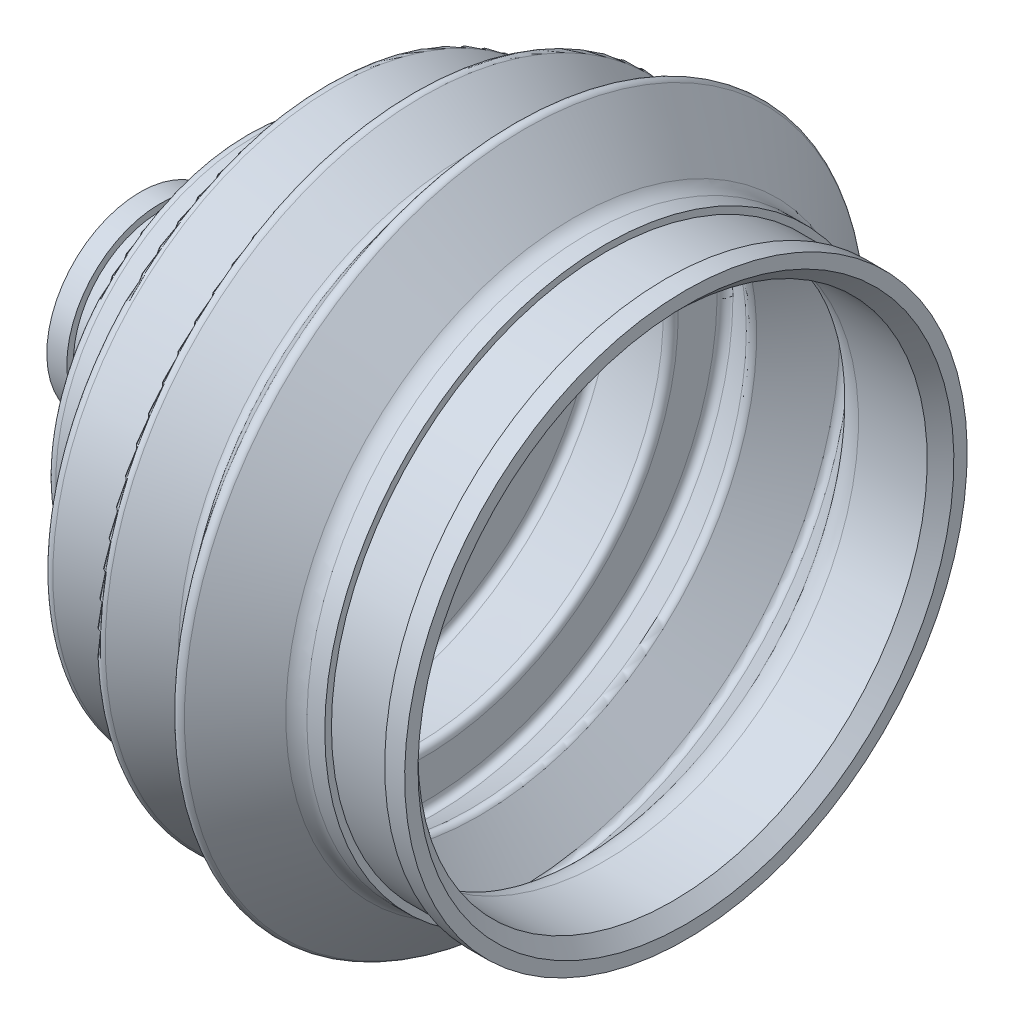
ISO-10303-21;
HEADER;
FILE_DESCRIPTION(('STEP AP214'),'2;1');
FILE_NAME('part.step','',(''),(''),'','','');
FILE_SCHEMA(('AUTOMOTIVE_DESIGN { 1 0 10303 214 1 1 1 1 }'));
ENDSEC;
DATA;
#1=APPLICATION_CONTEXT('core data for automotive mechanical design processes');
#2=APPLICATION_PROTOCOL_DEFINITION('international standard','automotive_design',2000,#1);
#3=PRODUCT_CONTEXT('',#1,'mechanical');
#4=PRODUCT('Part','Part','',(#3));
#5=PRODUCT_RELATED_PRODUCT_CATEGORY('part','',(#4));
#6=PRODUCT_DEFINITION_FORMATION('','',#4);
#7=PRODUCT_DEFINITION_CONTEXT('part definition',#1,'design');
#8=PRODUCT_DEFINITION('design','',#6,#7);
#9=PRODUCT_DEFINITION_SHAPE('','',#8);
#10=(LENGTH_UNIT() NAMED_UNIT(*) SI_UNIT(.MILLI.,.METRE.));
#11=(NAMED_UNIT(*) PLANE_ANGLE_UNIT() SI_UNIT($,.RADIAN.));
#12=(NAMED_UNIT(*) SI_UNIT($,.STERADIAN.) SOLID_ANGLE_UNIT());
#13=UNCERTAINTY_MEASURE_WITH_UNIT(LENGTH_MEASURE(1.E-05),#10,'distance_accuracy_value','');
#14=(GEOMETRIC_REPRESENTATION_CONTEXT(3) GLOBAL_UNCERTAINTY_ASSIGNED_CONTEXT((#13)) GLOBAL_UNIT_ASSIGNED_CONTEXT((#10,
#11,#12)) REPRESENTATION_CONTEXT('',''));
#15=CARTESIAN_POINT('',(0.,0.,0.));
#16=DIRECTION('',(0.,0.,1.));
#17=DIRECTION('',(1.,0.,0.));
#18=AXIS2_PLACEMENT_3D('',#15,#16,#17);
#19=CARTESIAN_POINT('',(0.,0.,0.));
#20=DIRECTION('',(1.,0.,0.));
#21=DIRECTION('',(0.,1.,0.));
#22=AXIS2_PLACEMENT_3D('',#19,#20,#21);
#23=CYLINDRICAL_SURFACE('',#22,42.25);
#24=CARTESIAN_POINT('',(-14.6865063047029,0.,0.));
#25=DIRECTION('',(1.,0.,0.));
#26=DIRECTION('',(0.,1.,0.));
#27=AXIS2_PLACEMENT_3D('',#24,#25,#26);
#28=CIRCLE('',#27,42.25);
#29=CARTESIAN_POINT('',(-14.6865063047029,42.25,0.));
#30=VERTEX_POINT('',#29);
#31=EDGE_CURVE('E73',#30,#30,#28,.T.);
#32=ORIENTED_EDGE('',*,*,#31,.T.);
#33=EDGE_LOOP('',(#32));
#34=FACE_BOUND('',#33,.T.);
#35=CARTESIAN_POINT('',(-12.,0.,0.));
#36=DIRECTION('',(-1.,0.,0.));
#37=DIRECTION('',(0.,0.,1.));
#38=AXIS2_PLACEMENT_3D('',#35,#36,#37);
#39=CIRCLE('',#38,42.25);
#40=CARTESIAN_POINT('',(-12.,0.,42.25));
#41=VERTEX_POINT('',#40);
#42=EDGE_CURVE('E190',#41,#41,#39,.T.);
#43=ORIENTED_EDGE('',*,*,#42,.T.);
#44=EDGE_LOOP('',(#43));
#45=FACE_BOUND('',#44,.T.);
#46=ADVANCED_FACE('F41',(#34,#45),#23,.T.);
#47=CARTESIAN_POINT('',(0.,0.,0.));
#48=DIRECTION('',(1.,0.,0.));
#49=DIRECTION('',(0.,1.,0.));
#50=AXIS2_PLACEMENT_3D('',#47,#48,#49);
#51=CYLINDRICAL_SURFACE('',#50,14.);
#52=CARTESIAN_POINT('',(-79.,0.,0.));
#53=DIRECTION('',(-1.,0.,0.));
#54=DIRECTION('',(0.,0.,1.));
#55=AXIS2_PLACEMENT_3D('',#52,#53,#54);
#56=CIRCLE('',#55,14.);
#57=CARTESIAN_POINT('',(-79.,0.,14.));
#58=VERTEX_POINT('',#57);
#59=EDGE_CURVE('E200',#58,#58,#56,.T.);
#60=ORIENTED_EDGE('',*,*,#59,.T.);
#61=EDGE_LOOP('',(#60));
#62=FACE_BOUND('',#61,.T.);
#63=CARTESIAN_POINT('',(-82.,0.,0.));
#64=DIRECTION('',(1.,0.,0.));
#65=DIRECTION('',(0.,1.,0.));
#66=AXIS2_PLACEMENT_3D('',#63,#64,#65);
#67=CIRCLE('',#66,14.);
#68=CARTESIAN_POINT('',(-82.,14.,0.));
#69=VERTEX_POINT('',#68);
#70=EDGE_CURVE('E217',#69,#69,#67,.T.);
#71=ORIENTED_EDGE('',*,*,#70,.T.);
#72=EDGE_LOOP('',(#71));
#73=FACE_BOUND('',#72,.T.);
#74=ADVANCED_FACE('F264',(#62,#73),#51,.T.);
#75=CARTESIAN_POINT('',(-24.9021727970763,0.,0.));
#76=DIRECTION('',(-1.,0.,0.));
#77=DIRECTION('',(0.,-1.,0.));
#78=AXIS2_PLACEMENT_3D('',#75,#76,#77);
#79=CONICAL_SURFACE('',#78,49.6825447785467,0.825376850520737);
#80=CARTESIAN_POINT('',(-24.1021512171663,0.,0.));
#81=DIRECTION('',(-1.,0.,0.));
#82=DIRECTION('',(0.,-1.,0.));
#83=AXIS2_PLACEMENT_3D('',#80,#81,#82);
#84=CIRCLE('',#83,48.8158547336442);
#85=CARTESIAN_POINT('',(-24.1021512171663,-48.8158547336442,0.));
#86=VERTEX_POINT('',#85);
#87=EDGE_CURVE('E133',#86,#86,#84,.T.);
#88=ORIENTED_EDGE('',*,*,#87,.T.);
#89=EDGE_LOOP('',(#88));
#90=FACE_BOUND('',#89,.T.);
#91=CARTESIAN_POINT('',(-16.6567468476485,0.,0.));
#92=DIRECTION('',(-1.,0.,0.));
#93=DIRECTION('',(0.,0.,1.));
#94=AXIS2_PLACEMENT_3D('',#91,#92,#93);
#95=CIRCLE('',#94,40.75);
#96=CARTESIAN_POINT('',(-16.6567468476485,0.,40.75));
#97=VERTEX_POINT('',#96);
#98=EDGE_CURVE('E204',#97,#97,#95,.T.);
#99=ORIENTED_EDGE('',*,*,#98,.F.);
#100=EDGE_LOOP('',(#99));
#101=FACE_BOUND('',#100,.T.);
#102=ADVANCED_FACE('F273',(#90,#101),#79,.F.);
#103=CARTESIAN_POINT('',(-31.6553927156199,0.,0.));
#104=DIRECTION('',(1.,0.,0.));
#105=DIRECTION('',(0.,1.,0.));
#106=AXIS2_PLACEMENT_3D('',#103,#104,#105);
#107=CONICAL_SURFACE('',#106,40.9998334547049,0.909753157944212);
#108=CARTESIAN_POINT('',(-31.0957786878303,0.,0.));
#109=DIRECTION('',(-1.,0.,0.));
#110=DIRECTION('',(0.,-1.,0.));
#111=AXIS2_PLACEMENT_3D('',#108,#109,#110);
#112=CIRCLE('',#111,41.71933720472);
#113=CARTESIAN_POINT('',(-31.0957786878303,-41.71933720472,0.));
#114=VERTEX_POINT('',#113);
#115=EDGE_CURVE('E137',#114,#114,#112,.T.);
#116=ORIENTED_EDGE('',*,*,#115,.T.);
#117=EDGE_LOOP('',(#116));
#118=FACE_BOUND('',#117,.T.);
#119=CARTESIAN_POINT('',(-25.6263068791701,0.,0.));
#120=DIRECTION('',(1.,0.,0.));
#121=DIRECTION('',(0.,1.,0.));
#122=AXIS2_PLACEMENT_3D('',#119,#120,#121);
#123=CIRCLE('',#122,48.751515244426);
#124=CARTESIAN_POINT('',(-25.6263068791701,48.751515244426,0.));
#125=VERTEX_POINT('',#124);
#126=EDGE_CURVE('E141',#125,#125,#123,.T.);
#127=ORIENTED_EDGE('',*,*,#126,.T.);
#128=EDGE_LOOP('',(#127));
#129=FACE_BOUND('',#128,.T.);
#130=ADVANCED_FACE('F355',(#118,#129),#107,.F.);
#131=CARTESIAN_POINT('',(-39.5,0.,0.));
#132=DIRECTION('',(-1.,0.,0.));
#133=DIRECTION('',(0.,-1.,0.));
#134=AXIS2_PLACEMENT_3D('',#131,#132,#133);
#135=CONICAL_SURFACE('',#134,46.0116658863922,0.568524547731038);
#136=CARTESIAN_POINT('',(-37.9616107228978,0.,0.));
#137=DIRECTION('',(-1.,0.,0.));
#138=DIRECTION('',(0.,-1.,0.));
#139=AXIS2_PLACEMENT_3D('',#136,#137,#138);
#140=CIRCLE('',#139,45.0288060704658);
#141=CARTESIAN_POINT('',(-37.9616107228978,-45.0288060704658,0.));
#142=VERTEX_POINT('',#141);
#143=EDGE_CURVE('E145',#142,#142,#140,.T.);
#144=ORIENTED_EDGE('',*,*,#143,.T.);
#145=EDGE_LOOP('',(#144));
#146=FACE_BOUND('',#145,.T.);
#147=CARTESIAN_POINT('',(-32.4235201823088,0.,0.));
#148=DIRECTION('',(1.,0.,0.));
#149=DIRECTION('',(0.,1.,0.));
#150=AXIS2_PLACEMENT_3D('',#147,#148,#149);
#151=CIRCLE('',#150,41.4905815584228);
#152=CARTESIAN_POINT('',(-32.4235201823088,41.4905815584228,0.));
#153=VERTEX_POINT('',#152);
#154=EDGE_CURVE('E149',#153,#153,#151,.T.);
#155=ORIENTED_EDGE('',*,*,#154,.T.);
#156=EDGE_LOOP('',(#155));
#157=FACE_BOUND('',#156,.T.);
#158=ADVANCED_FACE('F351',(#146,#157),#135,.F.);
#159=CARTESIAN_POINT('',(-39.5,39.,0.));
#160=DIRECTION('',(1.,0.,0.));
#161=DIRECTION('',(0.,1.,0.));
#162=AXIS2_PLACEMENT_3D('',#159,#160,#161);
#163=PLANE('',#162);
#164=CARTESIAN_POINT('',(-39.5,0.,0.));
#165=DIRECTION('',(1.,0.,0.));
#166=DIRECTION('',(0.,1.,0.));
#167=AXIS2_PLACEMENT_3D('',#164,#165,#166);
#168=CIRCLE('',#167,38.335382341241);
#169=CARTESIAN_POINT('',(-39.5,38.335382341241,0.));
#170=VERTEX_POINT('',#169);
#171=EDGE_CURVE('E153',#170,#170,#168,.F.);
#172=ORIENTED_EDGE('',*,*,#171,.T.);
#173=EDGE_LOOP('',(#172));
#174=FACE_BOUND('',#173,.T.);
#175=CARTESIAN_POINT('',(-39.5,0.,0.));
#176=DIRECTION('',(1.,0.,0.));
#177=DIRECTION('',(0.,1.,0.));
#178=AXIS2_PLACEMENT_3D('',#175,#176,#177);
#179=CIRCLE('',#178,44.1861098106536);
#180=CARTESIAN_POINT('',(-39.5,44.1861098106536,0.));
#181=VERTEX_POINT('',#180);
#182=EDGE_CURVE('E157',#181,#181,#179,.T.);
#183=ORIENTED_EDGE('',*,*,#182,.T.);
#184=EDGE_LOOP('',(#183));
#185=FACE_BOUND('',#184,.T.);
#186=ADVANCED_FACE('F347',(#174,#185),#163,.T.);
#187=CARTESIAN_POINT('',(-52.5,0.,0.));
#188=DIRECTION('',(-1.,0.,0.));
#189=DIRECTION('',(0.,-1.,0.));
#190=AXIS2_PLACEMENT_3D('',#187,#188,#189);
#191=CONICAL_SURFACE('',#190,40.7561470237229,0.280837724621203);
#192=CARTESIAN_POINT('',(-51.2228393486978,0.,0.));
#193=DIRECTION('',(-1.,0.,0.));
#194=DIRECTION('',(0.,-1.,0.));
#195=AXIS2_PLACEMENT_3D('',#192,#193,#194);
#196=CIRCLE('',#195,40.3877352973857);
#197=CARTESIAN_POINT('',(-51.2228393486978,-40.3877352973857,0.));
#198=VERTEX_POINT('',#197);
#199=EDGE_CURVE('E161',#198,#198,#196,.T.);
#200=ORIENTED_EDGE('',*,*,#199,.T.);
#201=EDGE_LOOP('',(#200));
#202=FACE_BOUND('',#201,.T.);
#203=CARTESIAN_POINT('',(-40.7771606513022,0.,0.));
#204=DIRECTION('',(1.,0.,0.));
#205=DIRECTION('',(0.,1.,0.));
#206=AXIS2_PLACEMENT_3D('',#203,#204,#205);
#207=CIRCLE('',#206,37.3745587500601);
#208=CARTESIAN_POINT('',(-40.7771606513022,37.3745587500601,0.));
#209=VERTEX_POINT('',#208);
#210=EDGE_CURVE('E165',#209,#209,#207,.T.);
#211=ORIENTED_EDGE('',*,*,#210,.T.);
#212=EDGE_LOOP('',(#211));
#213=FACE_BOUND('',#212,.T.);
#214=ADVANCED_FACE('F343',(#202,#213),#191,.F.);
#215=CARTESIAN_POINT('',(-52.5,27.,0.));
#216=DIRECTION('',(1.,0.,0.));
#217=DIRECTION('',(0.,1.,0.));
#218=AXIS2_PLACEMENT_3D('',#215,#216,#217);
#219=PLANE('',#218);
#220=CARTESIAN_POINT('',(-52.5,0.,0.));
#221=DIRECTION('',(1.,0.,0.));
#222=DIRECTION('',(0.,1.,0.));
#223=AXIS2_PLACEMENT_3D('',#220,#221,#222);
#224=CIRCLE('',#223,26.3465701350352);
#225=CARTESIAN_POINT('',(-52.5,26.3465701350351,0.));
#226=VERTEX_POINT('',#225);
#227=EDGE_CURVE('E169',#226,#226,#224,.F.);
#228=ORIENTED_EDGE('',*,*,#227,.T.);
#229=EDGE_LOOP('',(#228));
#230=FACE_BOUND('',#229,.T.);
#231=CARTESIAN_POINT('',(-52.5,0.,0.));
#232=DIRECTION('',(1.,0.,0.));
#233=DIRECTION('',(0.,1.,0.));
#234=AXIS2_PLACEMENT_3D('',#231,#232,#233);
#235=CIRCLE('',#234,39.4269117062048);
#236=CARTESIAN_POINT('',(-52.5,39.4269117062048,0.));
#237=VERTEX_POINT('',#236);
#238=EDGE_CURVE('E173',#237,#237,#235,.T.);
#239=ORIENTED_EDGE('',*,*,#238,.T.);
#240=EDGE_LOOP('',(#239));
#241=FACE_BOUND('',#240,.T.);
#242=ADVANCED_FACE('F339',(#230,#241),#219,.T.);
#243=CARTESIAN_POINT('',(-64.5,0.,0.));
#244=DIRECTION('',(-1.,0.,0.));
#245=DIRECTION('',(0.,-1.,0.));
#246=AXIS2_PLACEMENT_3D('',#243,#244,#245);
#247=CONICAL_SURFACE('',#246,28.2897104051055,0.264488382549233);
#248=CARTESIAN_POINT('',(-63.2385845242717,0.,0.));
#249=DIRECTION('',(-1.,0.,0.));
#250=DIRECTION('',(0.,-1.,0.));
#251=AXIS2_PLACEMENT_3D('',#248,#249,#250);
#252=CIRCLE('',#251,27.9480770470957);
#253=CARTESIAN_POINT('',(-63.2385845242717,-27.9480770470957,0.));
#254=VERTEX_POINT('',#253);
#255=EDGE_CURVE('E177',#254,#254,#252,.T.);
#256=ORIENTED_EDGE('',*,*,#255,.T.);
#257=EDGE_LOOP('',(#256));
#258=FACE_BOUND('',#257,.T.);
#259=CARTESIAN_POINT('',(-53.7614154757284,0.,0.));
#260=DIRECTION('',(1.,0.,0.));
#261=DIRECTION('',(0.,1.,0.));
#262=AXIS2_PLACEMENT_3D('',#259,#260,#261);
#263=CIRCLE('',#262,25.3813437631152);
#264=CARTESIAN_POINT('',(-53.7614154757284,25.3813437631152,0.));
#265=VERTEX_POINT('',#264);
#266=EDGE_CURVE('E181',#265,#265,#263,.T.);
#267=ORIENTED_EDGE('',*,*,#266,.T.);
#268=EDGE_LOOP('',(#267));
#269=FACE_BOUND('',#268,.T.);
#270=ADVANCED_FACE('F332',(#258,#269),#247,.F.);
#271=CARTESIAN_POINT('',(-64.5,14.,0.));
#272=DIRECTION('',(1.,0.,0.));
#273=DIRECTION('',(0.,1.,0.));
#274=AXIS2_PLACEMENT_3D('',#271,#272,#273);
#275=PLANE('',#274);
#276=CARTESIAN_POINT('',(-64.5,0.,0.));
#277=DIRECTION('',(1.,0.,0.));
#278=DIRECTION('',(0.,1.,0.));
#279=AXIS2_PLACEMENT_3D('',#276,#277,#278);
#280=CIRCLE('',#279,15.);
#281=CARTESIAN_POINT('',(-64.5,15.,0.));
#282=VERTEX_POINT('',#281);
#283=EDGE_CURVE('E10',#282,#282,#280,.F.);
#284=ORIENTED_EDGE('',*,*,#283,.T.);
#285=EDGE_LOOP('',(#284));
#286=FACE_BOUND('',#285,.T.);
#287=CARTESIAN_POINT('',(-64.5,0.,0.));
#288=DIRECTION('',(1.,0.,0.));
#289=DIRECTION('',(0.,1.,0.));
#290=AXIS2_PLACEMENT_3D('',#287,#288,#289);
#291=CIRCLE('',#290,26.9828506751758);
#292=CARTESIAN_POINT('',(-64.5,26.9828506751758,0.));
#293=VERTEX_POINT('',#292);
#294=EDGE_CURVE('E185',#293,#293,#291,.T.);
#295=ORIENTED_EDGE('',*,*,#294,.T.);
#296=EDGE_LOOP('',(#295));
#297=FACE_BOUND('',#296,.T.);
#298=ADVANCED_FACE('F325',(#286,#297),#275,.T.);
#299=CARTESIAN_POINT('',(-82.,12.5,0.));
#300=DIRECTION('',(1.,0.,0.));
#301=DIRECTION('',(0.,1.,0.));
#302=AXIS2_PLACEMENT_3D('',#299,#300,#301);
#303=PLANE('',#302);
#304=ORIENTED_EDGE('',*,*,#70,.F.);
#305=EDGE_LOOP('',(#304));
#306=FACE_BOUND('',#305,.T.);
#307=CARTESIAN_POINT('',(-82.,0.,0.));
#308=DIRECTION('',(1.,0.,0.));
#309=DIRECTION('',(0.,0.,-1.));
#310=AXIS2_PLACEMENT_3D('',#307,#308,#309);
#311=CIRCLE('',#310,9.99999999999999);
#312=CARTESIAN_POINT('',(-82.,0.,-9.99999999999999));
#313=VERTEX_POINT('',#312);
#314=EDGE_CURVE('E225',#313,#313,#311,.T.);
#315=ORIENTED_EDGE('',*,*,#314,.T.);
#316=EDGE_LOOP('',(#315));
#317=FACE_BOUND('',#316,.T.);
#318=ADVANCED_FACE('F323',(#306,#317),#303,.F.);
#319=CARTESIAN_POINT('',(-69.,0.,0.));
#320=DIRECTION('',(1.,0.,0.));
#321=DIRECTION('',(0.,1.,0.));
#322=AXIS2_PLACEMENT_3D('',#319,#320,#321);
#323=CIRCLE('',#322,14.);
#324=CARTESIAN_POINT('',(-69.,14.,0.));
#325=VERTEX_POINT('',#324);
#326=EDGE_CURVE('E59',#325,#325,#323,.F.);
#327=ORIENTED_EDGE('',*,*,#326,.T.);
#328=EDGE_LOOP('',(#327));
#329=FACE_BOUND('',#328,.T.);
#330=CARTESIAN_POINT('',(-70.,0.,0.));
#331=DIRECTION('',(1.,0.,0.));
#332=DIRECTION('',(0.,0.,-1.));
#333=AXIS2_PLACEMENT_3D('',#330,#331,#332);
#334=CIRCLE('',#333,14.);
#335=CARTESIAN_POINT('',(-70.,0.,-14.));
#336=VERTEX_POINT('',#335);
#337=EDGE_CURVE('E205',#336,#336,#334,.T.);
#338=ORIENTED_EDGE('',*,*,#337,.T.);
#339=EDGE_LOOP('',(#338));
#340=FACE_BOUND('',#339,.T.);
#341=ADVANCED_FACE('F276',(#329,#340),#51,.T.);
#342=CARTESIAN_POINT('',(-66.,14.,0.));
#343=DIRECTION('',(1.,0.,0.));
#344=DIRECTION('',(0.,1.,0.));
#345=AXIS2_PLACEMENT_3D('',#342,#343,#344);
#346=PLANE('',#345);
#347=CARTESIAN_POINT('',(-66.,0.,0.));
#348=DIRECTION('',(1.,0.,0.));
#349=DIRECTION('',(0.,1.,0.));
#350=AXIS2_PLACEMENT_3D('',#347,#348,#349);
#351=CIRCLE('',#350,17.);
#352=CARTESIAN_POINT('',(-66.,17.,0.));
#353=VERTEX_POINT('',#352);
#354=EDGE_CURVE('E65',#353,#353,#351,.T.);
#355=ORIENTED_EDGE('',*,*,#354,.T.);
#356=EDGE_LOOP('',(#355));
#357=FACE_BOUND('',#356,.T.);
#358=CARTESIAN_POINT('',(-66.,0.,0.));
#359=DIRECTION('',(1.,0.,0.));
#360=DIRECTION('',(0.,1.,0.));
#361=AXIS2_PLACEMENT_3D('',#358,#359,#360);
#362=CIRCLE('',#361,28.9431402700703);
#363=CARTESIAN_POINT('',(-66.,28.9431402700703,0.));
#364=VERTEX_POINT('',#363);
#365=EDGE_CURVE('E77',#364,#364,#362,.F.);
#366=ORIENTED_EDGE('',*,*,#365,.T.);
#367=EDGE_LOOP('',(#366));
#368=FACE_BOUND('',#367,.T.);
#369=ADVANCED_FACE('F330',(#357,#368),#346,.F.);
#370=CARTESIAN_POINT('',(-66.,0.,0.));
#371=DIRECTION('',(-1.,0.,0.));
#372=DIRECTION('',(0.,-1.,0.));
#373=AXIS2_PLACEMENT_3D('',#370,#371,#372);
#374=CONICAL_SURFACE('',#373,30.25,0.264488382549233);
#375=CARTESIAN_POINT('',(-55.2614154757284,0.,0.));
#376=DIRECTION('',(-1.,0.,0.));
#377=DIRECTION('',(0.,-1.,0.));
#378=AXIS2_PLACEMENT_3D('',#375,#376,#377);
#379=CIRCLE('',#378,27.3416333580097);
#380=CARTESIAN_POINT('',(-55.2614154757284,-27.3416333580098,0.));
#381=VERTEX_POINT('',#380);
#382=EDGE_CURVE('E85',#381,#381,#379,.T.);
#383=ORIENTED_EDGE('',*,*,#382,.T.);
#384=EDGE_LOOP('',(#383));
#385=FACE_BOUND('',#384,.T.);
#386=CARTESIAN_POINT('',(-64.7385845242717,0.,0.));
#387=DIRECTION('',(1.,0.,0.));
#388=DIRECTION('',(0.,1.,0.));
#389=AXIS2_PLACEMENT_3D('',#386,#387,#388);
#390=CIRCLE('',#389,29.9083666419902);
#391=CARTESIAN_POINT('',(-64.7385845242717,29.9083666419902,0.));
#392=VERTEX_POINT('',#391);
#393=EDGE_CURVE('E89',#392,#392,#390,.T.);
#394=ORIENTED_EDGE('',*,*,#393,.T.);
#395=EDGE_LOOP('',(#394));
#396=FACE_BOUND('',#395,.T.);
#397=ADVANCED_FACE('F600',(#385,#396),#374,.T.);
#398=CARTESIAN_POINT('',(-54.,27.,0.));
#399=DIRECTION('',(1.,0.,0.));
#400=DIRECTION('',(0.,1.,0.));
#401=AXIS2_PLACEMENT_3D('',#398,#399,#400);
#402=PLANE('',#401);
#403=CARTESIAN_POINT('',(-54.,0.,0.));
#404=DIRECTION('',(1.,0.,0.));
#405=DIRECTION('',(0.,1.,0.));
#406=AXIS2_PLACEMENT_3D('',#403,#404,#405);
#407=CIRCLE('',#406,28.3068597299297);
#408=CARTESIAN_POINT('',(-54.,28.3068597299297,0.));
#409=VERTEX_POINT('',#408);
#410=EDGE_CURVE('E93',#409,#409,#407,.T.);
#411=ORIENTED_EDGE('',*,*,#410,.T.);
#412=EDGE_LOOP('',(#411));
#413=FACE_BOUND('',#412,.T.);
#414=CARTESIAN_POINT('',(-54.,0.,0.));
#415=DIRECTION('',(1.,0.,0.));
#416=DIRECTION('',(0.,1.,0.));
#417=AXIS2_PLACEMENT_3D('',#414,#415,#416);
#418=CIRCLE('',#417,41.4207646824819);
#419=CARTESIAN_POINT('',(-54.,41.4207646824819,0.));
#420=VERTEX_POINT('',#419);
#421=EDGE_CURVE('E97',#420,#420,#418,.F.);
#422=ORIENTED_EDGE('',*,*,#421,.T.);
#423=EDGE_LOOP('',(#422));
#424=FACE_BOUND('',#423,.T.);
#425=ADVANCED_FACE('F604',(#413,#424),#402,.F.);
#426=CARTESIAN_POINT('',(-54.,0.,0.));
#427=DIRECTION('',(-1.,0.,0.));
#428=DIRECTION('',(0.,-1.,0.));
#429=AXIS2_PLACEMENT_3D('',#426,#427,#428);
#430=CONICAL_SURFACE('',#429,42.75,0.280837724621203);
#431=CARTESIAN_POINT('',(-42.2771606513022,0.,0.));
#432=DIRECTION('',(-1.,0.,0.));
#433=DIRECTION('',(0.,-1.,0.));
#434=AXIS2_PLACEMENT_3D('',#431,#432,#433);
#435=CIRCLE('',#434,39.3684117263372);
#436=CARTESIAN_POINT('',(-42.2771606513022,-39.3684117263372,0.));
#437=VERTEX_POINT('',#436);
#438=EDGE_CURVE('E101',#437,#437,#435,.T.);
#439=ORIENTED_EDGE('',*,*,#438,.T.);
#440=EDGE_LOOP('',(#439));
#441=FACE_BOUND('',#440,.T.);
#442=CARTESIAN_POINT('',(-52.7228393486978,0.,0.));
#443=DIRECTION('',(1.,0.,0.));
#444=DIRECTION('',(0.,1.,0.));
#445=AXIS2_PLACEMENT_3D('',#442,#443,#444);
#446=CIRCLE('',#445,42.3815882736628);
#447=CARTESIAN_POINT('',(-52.7228393486978,42.3815882736628,0.));
#448=VERTEX_POINT('',#447);
#449=EDGE_CURVE('E105',#448,#448,#446,.T.);
#450=ORIENTED_EDGE('',*,*,#449,.T.);
#451=EDGE_LOOP('',(#450));
#452=FACE_BOUND('',#451,.T.);
#453=ADVANCED_FACE('F613',(#441,#452),#430,.T.);
#454=CARTESIAN_POINT('',(-41.,39.,0.));
#455=DIRECTION('',(1.,0.,0.));
#456=DIRECTION('',(0.,1.,0.));
#457=AXIS2_PLACEMENT_3D('',#454,#455,#456);
#458=PLANE('',#457);
#459=CARTESIAN_POINT('',(-41.,0.,0.));
#460=DIRECTION('',(1.,0.,0.));
#461=DIRECTION('',(0.,1.,0.));
#462=AXIS2_PLACEMENT_3D('',#459,#460,#461);
#463=CIRCLE('',#462,40.3292353175181);
#464=CARTESIAN_POINT('',(-41.,40.3292353175181,0.));
#465=VERTEX_POINT('',#464);
#466=EDGE_CURVE('E109',#465,#465,#463,.T.);
#467=ORIENTED_EDGE('',*,*,#466,.T.);
#468=EDGE_LOOP('',(#467));
#469=FACE_BOUND('',#468,.T.);
#470=CARTESIAN_POINT('',(-41.,0.,0.));
#471=DIRECTION('',(1.,0.,0.));
#472=DIRECTION('',(0.,1.,0.));
#473=AXIS2_PLACEMENT_3D('',#470,#471,#472);
#474=CIRCLE('',#473,46.9244439242615);
#475=CARTESIAN_POINT('',(-41.,46.9244439242614,0.));
#476=VERTEX_POINT('',#475);
#477=EDGE_CURVE('E113',#476,#476,#474,.F.);
#478=ORIENTED_EDGE('',*,*,#477,.T.);
#479=EDGE_LOOP('',(#478));
#480=FACE_BOUND('',#479,.T.);
#481=ADVANCED_FACE('F621',(#469,#480),#458,.F.);
#482=CARTESIAN_POINT('',(-41.,0.,0.));
#483=DIRECTION('',(-1.,0.,0.));
#484=DIRECTION('',(0.,-1.,0.));
#485=AXIS2_PLACEMENT_3D('',#482,#483,#484);
#486=CONICAL_SURFACE('',#485,48.75,0.568524547731039);
#487=CARTESIAN_POINT('',(-32.768127466689,0.,0.));
#488=DIRECTION('',(-1.,0.,0.));
#489=DIRECTION('',(0.,-1.,0.));
#490=AXIS2_PLACEMENT_3D('',#487,#488,#489);
#491=CIRCLE('',#490,43.4907481037179);
#492=CARTESIAN_POINT('',(-32.768127466689,-43.4907481037179,0.));
#493=VERTEX_POINT('',#492);
#494=EDGE_CURVE('E117',#493,#493,#491,.T.);
#495=ORIENTED_EDGE('',*,*,#494,.T.);
#496=EDGE_LOOP('',(#495));
#497=FACE_BOUND('',#496,.T.);
#498=CARTESIAN_POINT('',(-39.4616107228978,0.,0.));
#499=DIRECTION('',(1.,0.,0.));
#500=DIRECTION('',(0.,1.,0.));
#501=AXIS2_PLACEMENT_3D('',#498,#499,#500);
#502=CIRCLE('',#501,47.7671401840736);
#503=CARTESIAN_POINT('',(-39.4616107228978,47.7671401840736,0.));
#504=VERTEX_POINT('',#503);
#505=EDGE_CURVE('E121',#504,#504,#502,.T.);
#506=ORIENTED_EDGE('',*,*,#505,.T.);
#507=EDGE_LOOP('',(#506));
#508=FACE_BOUND('',#507,.T.);
#509=ADVANCED_FACE('F629',(#497,#508),#486,.T.);
#510=CARTESIAN_POINT('',(-32.,0.,0.));
#511=DIRECTION('',(1.,0.,0.));
#512=DIRECTION('',(0.,1.,0.));
#513=AXIS2_PLACEMENT_3D('',#510,#511,#512);
#514=CONICAL_SURFACE('',#513,43.,0.909753157944212);
#515=CARTESIAN_POINT('',(-31.4403859722104,0.,0.));
#516=DIRECTION('',(1.,0.,0.));
#517=DIRECTION('',(0.,1.,0.));
#518=AXIS2_PLACEMENT_3D('',#515,#516,#517);
#519=CIRCLE('',#518,43.7195037500152);
#520=CARTESIAN_POINT('',(-31.4403859722104,43.7195037500152,0.));
#521=VERTEX_POINT('',#520);
#522=EDGE_CURVE('E125',#521,#521,#519,.T.);
#523=ORIENTED_EDGE('',*,*,#522,.T.);
#524=EDGE_LOOP('',(#523));
#525=FACE_BOUND('',#524,.T.);
#526=CARTESIAN_POINT('',(-25.7241340820939,0.,0.));
#527=DIRECTION('',(-1.,0.,0.));
#528=DIRECTION('',(0.,-1.,0.));
#529=AXIS2_PLACEMENT_3D('',#526,#527,#528);
#530=CIRCLE('',#529,51.0689704658793);
#531=CARTESIAN_POINT('',(-25.7241340820938,-51.0689704658793,0.));
#532=VERTEX_POINT('',#531);
#533=EDGE_CURVE('E129',#532,#532,#530,.T.);
#534=ORIENTED_EDGE('',*,*,#533,.T.);
#535=EDGE_LOOP('',(#534));
#536=FACE_BOUND('',#535,.T.);
#537=ADVANCED_FACE('F290',(#525,#536),#514,.T.);
#538=CARTESIAN_POINT('',(-25.,0.,0.));
#539=DIRECTION('',(-1.,0.,0.));
#540=DIRECTION('',(0.,-1.,0.));
#541=AXIS2_PLACEMENT_3D('',#538,#539,#540);
#542=CONICAL_SURFACE('',#541,52.,0.825376850520737);
#543=CARTESIAN_POINT('',(-16.8909166385854,0.,0.));
#544=DIRECTION('',(-1.,0.,0.));
#545=DIRECTION('',(0.,-1.,0.));
#546=AXIS2_PLACEMENT_3D('',#543,#544,#545);
#547=CIRCLE('',#546,43.2151596918008);
#548=CARTESIAN_POINT('',(-16.8909166385853,-43.2151596918008,0.));
#549=VERTEX_POINT('',#548);
#550=EDGE_CURVE('E69',#549,#549,#547,.T.);
#551=ORIENTED_EDGE('',*,*,#550,.T.);
#552=EDGE_LOOP('',(#551));
#553=FACE_BOUND('',#552,.T.);
#554=CARTESIAN_POINT('',(-24.19997842009,0.,0.));
#555=DIRECTION('',(1.,0.,0.));
#556=DIRECTION('',(0.,1.,0.));
#557=AXIS2_PLACEMENT_3D('',#554,#555,#556);
#558=CIRCLE('',#557,51.1333099550975);
#559=CARTESIAN_POINT('',(-24.19997842009,51.1333099550975,0.));
#560=VERTEX_POINT('',#559);
#561=EDGE_CURVE('E81',#560,#560,#558,.T.);
#562=ORIENTED_EDGE('',*,*,#561,.T.);
#563=EDGE_LOOP('',(#562));
#564=FACE_BOUND('',#563,.T.);
#565=ADVANCED_FACE('F281',(#553,#564),#542,.T.);
#566=CARTESIAN_POINT('',(-2.99999999999999,0.,0.));
#567=DIRECTION('',(1.,0.,0.));
#568=DIRECTION('',(0.,0.,-1.));
#569=AXIS2_PLACEMENT_3D('',#566,#567,#568);
#570=CIRCLE('',#569,42.25);
#571=CARTESIAN_POINT('',(-2.99999999999999,0.,-42.25));
#572=VERTEX_POINT('',#571);
#573=EDGE_CURVE('E195',#572,#572,#570,.T.);
#574=ORIENTED_EDGE('',*,*,#573,.T.);
#575=EDGE_LOOP('',(#574));
#576=FACE_BOUND('',#575,.T.);
#577=CARTESIAN_POINT('',(0.,0.,0.));
#578=DIRECTION('',(1.,0.,0.));
#579=DIRECTION('',(0.,1.,0.));
#580=AXIS2_PLACEMENT_3D('',#577,#578,#579);
#581=CIRCLE('',#580,42.25);
#582=CARTESIAN_POINT('',(0.,42.25,0.));
#583=VERTEX_POINT('',#582);
#584=EDGE_CURVE('E221',#583,#583,#581,.T.);
#585=ORIENTED_EDGE('',*,*,#584,.F.);
#586=EDGE_LOOP('',(#585));
#587=FACE_BOUND('',#586,.T.);
#588=ADVANCED_FACE('F267',(#576,#587),#23,.T.);
#589=CARTESIAN_POINT('',(0.,42.25,0.));
#590=DIRECTION('',(-1.,0.,0.));
#591=DIRECTION('',(0.,-1.,0.));
#592=AXIS2_PLACEMENT_3D('',#589,#590,#591);
#593=PLANE('',#592);
#594=CARTESIAN_POINT('',(0.,0.,0.));
#595=DIRECTION('',(-1.,0.,0.));
#596=DIRECTION('',(0.,-1.,0.));
#597=AXIS2_PLACEMENT_3D('',#594,#595,#596);
#598=CIRCLE('',#597,40.25);
#599=CARTESIAN_POINT('',(0.,-40.25,0.));
#600=VERTEX_POINT('',#599);
#601=EDGE_CURVE('E189',#600,#600,#598,.T.);
#602=ORIENTED_EDGE('',*,*,#601,.T.);
#603=EDGE_LOOP('',(#602));
#604=FACE_BOUND('',#603,.T.);
#605=ORIENTED_EDGE('',*,*,#584,.T.);
#606=EDGE_LOOP('',(#605));
#607=FACE_BOUND('',#606,.T.);
#608=ADVANCED_FACE('F280',(#604,#607),#593,.F.);
#609=CARTESIAN_POINT('',(0.,0.,0.));
#610=DIRECTION('',(1.,0.,0.));
#611=DIRECTION('',(0.,0.,-1.));
#612=AXIS2_PLACEMENT_3D('',#609,#610,#611);
#613=CYLINDRICAL_SURFACE('',#612,9.99999999999999);
#614=CARTESIAN_POINT('',(-69.5,0.,0.));
#615=DIRECTION('',(1.,0.,0.));
#616=DIRECTION('',(0.,1.,0.));
#617=AXIS2_PLACEMENT_3D('',#614,#615,#616);
#618=CIRCLE('',#617,9.99999999999999);
#619=CARTESIAN_POINT('',(-69.5,9.99999999999999,0.));
#620=VERTEX_POINT('',#619);
#621=EDGE_CURVE('E49',#620,#620,#618,.T.);
#622=ORIENTED_EDGE('',*,*,#621,.T.);
#623=EDGE_LOOP('',(#622));
#624=FACE_BOUND('',#623,.T.);
#625=ORIENTED_EDGE('',*,*,#314,.F.);
#626=EDGE_LOOP('',(#625));
#627=FACE_BOUND('',#626,.T.);
#628=ADVANCED_FACE('F287',(#624,#627),#613,.F.);
#629=CARTESIAN_POINT('',(0.,0.,0.));
#630=DIRECTION('',(1.,0.,0.));
#631=DIRECTION('',(0.,0.,-1.));
#632=AXIS2_PLACEMENT_3D('',#629,#630,#631);
#633=CYLINDRICAL_SURFACE('',#632,38.25);
#634=CARTESIAN_POINT('',(-12.3266198287264,0.,0.));
#635=DIRECTION('',(-1.,0.,0.));
#636=DIRECTION('',(0.,0.,1.));
#637=AXIS2_PLACEMENT_3D('',#634,#635,#636);
#638=CIRCLE('',#637,38.25);
#639=CARTESIAN_POINT('',(-12.3266198287264,0.,38.25));
#640=VERTEX_POINT('',#639);
#641=EDGE_CURVE('E54',#640,#640,#638,.T.);
#642=ORIENTED_EDGE('',*,*,#641,.T.);
#643=EDGE_LOOP('',(#642));
#644=FACE_BOUND('',#643,.T.);
#645=CARTESIAN_POINT('',(-1.99999999999998,0.,0.));
#646=DIRECTION('',(-1.,0.,0.));
#647=DIRECTION('',(0.,0.,1.));
#648=AXIS2_PLACEMENT_3D('',#645,#646,#647);
#649=CIRCLE('',#648,38.25);
#650=CARTESIAN_POINT('',(-1.99999999999998,0.,38.25));
#651=VERTEX_POINT('',#650);
#652=EDGE_CURVE('E213',#651,#651,#649,.F.);
#653=ORIENTED_EDGE('',*,*,#652,.T.);
#654=EDGE_LOOP('',(#653));
#655=FACE_BOUND('',#654,.T.);
#656=ADVANCED_FACE('F312',(#644,#655),#633,.F.);
#657=CARTESIAN_POINT('',(-1.99999999999998,0.,0.));
#658=DIRECTION('',(1.,0.,0.));
#659=DIRECTION('',(0.,0.,-1.));
#660=AXIS2_PLACEMENT_3D('',#657,#658,#659);
#661=CONICAL_SURFACE('',#660,38.25,0.785398163397447);
#662=ORIENTED_EDGE('',*,*,#601,.F.);
#663=EDGE_LOOP('',(#662));
#664=FACE_BOUND('',#663,.T.);
#665=ORIENTED_EDGE('',*,*,#652,.F.);
#666=EDGE_LOOP('',(#665));
#667=FACE_BOUND('',#666,.T.);
#668=ADVANCED_FACE('F310',(#664,#667),#661,.F.);
#669=CARTESIAN_POINT('',(-79.,18.,0.));
#670=DIRECTION('',(-1.,0.,0.));
#671=DIRECTION('',(0.,0.,1.));
#672=AXIS2_PLACEMENT_3D('',#669,#670,#671);
#673=PLANE('',#672);
#674=CARTESIAN_POINT('',(-79.,0.,0.));
#675=DIRECTION('',(1.,0.,0.));
#676=DIRECTION('',(0.,0.,-1.));
#677=AXIS2_PLACEMENT_3D('',#674,#675,#676);
#678=CIRCLE('',#677,13.);
#679=CARTESIAN_POINT('',(-79.,0.,-13.));
#680=VERTEX_POINT('',#679);
#681=EDGE_CURVE('E209',#680,#680,#678,.T.);
#682=ORIENTED_EDGE('',*,*,#681,.F.);
#683=EDGE_LOOP('',(#682));
#684=FACE_BOUND('',#683,.T.);
#685=ORIENTED_EDGE('',*,*,#59,.F.);
#686=EDGE_LOOP('',(#685));
#687=FACE_BOUND('',#686,.T.);
#688=ADVANCED_FACE('F304',(#684,#687),#673,.F.);
#689=CARTESIAN_POINT('',(-70.,18.,0.));
#690=DIRECTION('',(1.,0.,0.));
#691=DIRECTION('',(0.,0.,-1.));
#692=AXIS2_PLACEMENT_3D('',#689,#690,#691);
#693=PLANE('',#692);
#694=CARTESIAN_POINT('',(-70.,0.,0.));
#695=DIRECTION('',(1.,0.,0.));
#696=DIRECTION('',(0.,0.,-1.));
#697=AXIS2_PLACEMENT_3D('',#694,#695,#696);
#698=CIRCLE('',#697,13.);
#699=CARTESIAN_POINT('',(-70.,0.,-13.));
#700=VERTEX_POINT('',#699);
#701=EDGE_CURVE('E194',#700,#700,#698,.T.);
#702=ORIENTED_EDGE('',*,*,#701,.T.);
#703=EDGE_LOOP('',(#702));
#704=FACE_BOUND('',#703,.T.);
#705=ORIENTED_EDGE('',*,*,#337,.F.);
#706=EDGE_LOOP('',(#705));
#707=FACE_BOUND('',#706,.T.);
#708=ADVANCED_FACE('F301',(#704,#707),#693,.F.);
#709=CARTESIAN_POINT('',(0.,0.,0.));
#710=DIRECTION('',(1.,0.,0.));
#711=DIRECTION('',(0.,0.,-1.));
#712=AXIS2_PLACEMENT_3D('',#709,#710,#711);
#713=CYLINDRICAL_SURFACE('',#712,13.);
#714=ORIENTED_EDGE('',*,*,#701,.F.);
#715=EDGE_LOOP('',(#714));
#716=FACE_BOUND('',#715,.T.);
#717=ORIENTED_EDGE('',*,*,#681,.T.);
#718=EDGE_LOOP('',(#717));
#719=FACE_BOUND('',#718,.T.);
#720=ADVANCED_FACE('F259',(#716,#719),#713,.T.);
#721=CARTESIAN_POINT('',(-12.,46.25,0.));
#722=DIRECTION('',(-1.,0.,0.));
#723=DIRECTION('',(0.,0.,1.));
#724=AXIS2_PLACEMENT_3D('',#721,#722,#723);
#725=PLANE('',#724);
#726=CARTESIAN_POINT('',(-12.,0.,0.));
#727=DIRECTION('',(1.,0.,0.));
#728=DIRECTION('',(0.,0.,-1.));
#729=AXIS2_PLACEMENT_3D('',#726,#727,#728);
#730=CIRCLE('',#729,41.25);
#731=CARTESIAN_POINT('',(-12.,0.,-41.25));
#732=VERTEX_POINT('',#731);
#733=EDGE_CURVE('E199',#732,#732,#730,.T.);
#734=ORIENTED_EDGE('',*,*,#733,.F.);
#735=EDGE_LOOP('',(#734));
#736=FACE_BOUND('',#735,.T.);
#737=ORIENTED_EDGE('',*,*,#42,.F.);
#738=EDGE_LOOP('',(#737));
#739=FACE_BOUND('',#738,.T.);
#740=ADVANCED_FACE('F256',(#736,#739),#725,.F.);
#741=CARTESIAN_POINT('',(-2.99999999999999,46.25,0.));
#742=DIRECTION('',(1.,0.,0.));
#743=DIRECTION('',(0.,0.,-1.));
#744=AXIS2_PLACEMENT_3D('',#741,#742,#743);
#745=PLANE('',#744);
#746=CARTESIAN_POINT('',(-2.99999999999999,0.,0.));
#747=DIRECTION('',(1.,0.,0.));
#748=DIRECTION('',(0.,0.,-1.));
#749=AXIS2_PLACEMENT_3D('',#746,#747,#748);
#750=CIRCLE('',#749,41.25);
#751=CARTESIAN_POINT('',(-2.99999999999999,0.,-41.25));
#752=VERTEX_POINT('',#751);
#753=EDGE_CURVE('E241',#752,#752,#750,.T.);
#754=ORIENTED_EDGE('',*,*,#753,.T.);
#755=EDGE_LOOP('',(#754));
#756=FACE_BOUND('',#755,.T.);
#757=ORIENTED_EDGE('',*,*,#573,.F.);
#758=EDGE_LOOP('',(#757));
#759=FACE_BOUND('',#758,.T.);
#760=ADVANCED_FACE('F246',(#756,#759),#745,.F.);
#761=CARTESIAN_POINT('',(0.,0.,0.));
#762=DIRECTION('',(1.,0.,0.));
#763=DIRECTION('',(0.,0.,-1.));
#764=AXIS2_PLACEMENT_3D('',#761,#762,#763);
#765=CYLINDRICAL_SURFACE('',#764,41.25);
#766=ORIENTED_EDGE('',*,*,#753,.F.);
#767=EDGE_LOOP('',(#766));
#768=FACE_BOUND('',#767,.T.);
#769=ORIENTED_EDGE('',*,*,#733,.T.);
#770=EDGE_LOOP('',(#769));
#771=FACE_BOUND('',#770,.T.);
#772=ADVANCED_FACE('F249',(#768,#771),#765,.T.);
#773=CARTESIAN_POINT('',(-63.5,0.,0.));
#774=DIRECTION('',(1.,0.,0.));
#775=DIRECTION('',(0.,1.,0.));
#776=AXIS2_PLACEMENT_3D('',#773,#774,#775);
#777=TOROIDAL_SURFACE('',#776,26.9828506751758,1.);
#778=ORIENTED_EDGE('',*,*,#255,.F.);
#779=EDGE_LOOP('',(#778));
#780=FACE_BOUND('',#779,.T.);
#781=ORIENTED_EDGE('',*,*,#294,.F.);
#782=EDGE_LOOP('',(#781));
#783=FACE_BOUND('',#782,.T.);
#784=ADVANCED_FACE('F252',(#780,#783),#777,.F.);
#785=CARTESIAN_POINT('',(-53.5,0.,0.));
#786=DIRECTION('',(1.,0.,0.));
#787=DIRECTION('',(0.,1.,0.));
#788=AXIS2_PLACEMENT_3D('',#785,#786,#787);
#789=TOROIDAL_SURFACE('',#788,26.3465701350352,1.);
#790=ORIENTED_EDGE('',*,*,#227,.F.);
#791=EDGE_LOOP('',(#790));
#792=FACE_BOUND('',#791,.T.);
#793=ORIENTED_EDGE('',*,*,#266,.F.);
#794=EDGE_LOOP('',(#793));
#795=FACE_BOUND('',#794,.T.);
#796=ADVANCED_FACE('F368',(#792,#795),#789,.T.);
#797=CARTESIAN_POINT('',(-51.5,0.,0.));
#798=DIRECTION('',(1.,0.,0.));
#799=DIRECTION('',(0.,1.,0.));
#800=AXIS2_PLACEMENT_3D('',#797,#798,#799);
#801=TOROIDAL_SURFACE('',#800,39.4269117062048,1.);
#802=ORIENTED_EDGE('',*,*,#199,.F.);
#803=EDGE_LOOP('',(#802));
#804=FACE_BOUND('',#803,.T.);
#805=ORIENTED_EDGE('',*,*,#238,.F.);
#806=EDGE_LOOP('',(#805));
#807=FACE_BOUND('',#806,.T.);
#808=ADVANCED_FACE('F372',(#804,#807),#801,.F.);
#809=CARTESIAN_POINT('',(-40.5,0.,0.));
#810=DIRECTION('',(1.,0.,0.));
#811=DIRECTION('',(0.,1.,0.));
#812=AXIS2_PLACEMENT_3D('',#809,#810,#811);
#813=TOROIDAL_SURFACE('',#812,38.335382341241,1.);
#814=ORIENTED_EDGE('',*,*,#171,.F.);
#815=EDGE_LOOP('',(#814));
#816=FACE_BOUND('',#815,.T.);
#817=ORIENTED_EDGE('',*,*,#210,.F.);
#818=EDGE_LOOP('',(#817));
#819=FACE_BOUND('',#818,.T.);
#820=ADVANCED_FACE('F376',(#816,#819),#813,.T.);
#821=CARTESIAN_POINT('',(-38.5,0.,0.));
#822=DIRECTION('',(1.,0.,0.));
#823=DIRECTION('',(0.,1.,0.));
#824=AXIS2_PLACEMENT_3D('',#821,#822,#823);
#825=TOROIDAL_SURFACE('',#824,44.1861098106536,1.);
#826=ORIENTED_EDGE('',*,*,#143,.F.);
#827=EDGE_LOOP('',(#826));
#828=FACE_BOUND('',#827,.T.);
#829=ORIENTED_EDGE('',*,*,#182,.F.);
#830=EDGE_LOOP('',(#829));
#831=FACE_BOUND('',#830,.T.);
#832=ADVANCED_FACE('F380',(#828,#831),#825,.F.);
#833=CARTESIAN_POINT('',(-31.8851309052066,0.,0.));
#834=DIRECTION('',(-1.,0.,0.));
#835=DIRECTION('',(0.,-1.,0.));
#836=AXIS2_PLACEMENT_3D('',#833,#834,#835);
#837=TOROIDAL_SURFACE('',#836,42.333277818235,1.);
#838=ORIENTED_EDGE('',*,*,#115,.F.);
#839=EDGE_LOOP('',(#838));
#840=FACE_BOUND('',#839,.T.);
#841=ORIENTED_EDGE('',*,*,#154,.F.);
#842=EDGE_LOOP('',(#841));
#843=FACE_BOUND('',#842,.T.);
#844=ADVANCED_FACE('F384',(#840,#843),#837,.T.);
#845=CARTESIAN_POINT('',(-24.8369546617938,0.,0.));
#846=DIRECTION('',(1.,0.,0.));
#847=DIRECTION('',(0.,1.,0.));
#848=AXIS2_PLACEMENT_3D('',#845,#846,#847);
#849=TOROIDAL_SURFACE('',#848,48.1375746309111,1.);
#850=ORIENTED_EDGE('',*,*,#87,.F.);
#851=EDGE_LOOP('',(#850));
#852=FACE_BOUND('',#851,.T.);
#853=ORIENTED_EDGE('',*,*,#126,.F.);
#854=EDGE_LOOP('',(#853));
#855=FACE_BOUND('',#854,.T.);
#856=ADVANCED_FACE('F388',(#852,#855),#849,.F.);
#857=CARTESIAN_POINT('',(-32.2297381895867,0.,0.));
#858=DIRECTION('',(1.,0.,0.));
#859=DIRECTION('',(0.,1.,0.));
#860=AXIS2_PLACEMENT_3D('',#857,#858,#859);
#861=TOROIDAL_SURFACE('',#860,44.3334443635301,1.);
#862=ORIENTED_EDGE('',*,*,#494,.F.);
#863=EDGE_LOOP('',(#862));
#864=FACE_BOUND('',#863,.T.);
#865=ORIENTED_EDGE('',*,*,#522,.F.);
#866=EDGE_LOOP('',(#865));
#867=FACE_BOUND('',#866,.T.);
#868=ADVANCED_FACE('F392',(#864,#867),#861,.F.);
#869=CARTESIAN_POINT('',(-42.,0.,0.));
#870=DIRECTION('',(1.,0.,0.));
#871=DIRECTION('',(0.,1.,0.));
#872=AXIS2_PLACEMENT_3D('',#869,#870,#871);
#873=TOROIDAL_SURFACE('',#872,40.3292353175181,1.);
#874=ORIENTED_EDGE('',*,*,#438,.F.);
#875=EDGE_LOOP('',(#874));
#876=FACE_BOUND('',#875,.T.);
#877=ORIENTED_EDGE('',*,*,#466,.F.);
#878=EDGE_LOOP('',(#877));
#879=FACE_BOUND('',#878,.T.);
#880=ADVANCED_FACE('F396',(#876,#879),#873,.F.);
#881=CARTESIAN_POINT('',(-55.,0.,0.));
#882=DIRECTION('',(1.,0.,0.));
#883=DIRECTION('',(0.,1.,0.));
#884=AXIS2_PLACEMENT_3D('',#881,#882,#883);
#885=TOROIDAL_SURFACE('',#884,28.3068597299297,1.);
#886=ORIENTED_EDGE('',*,*,#382,.F.);
#887=EDGE_LOOP('',(#886));
#888=FACE_BOUND('',#887,.T.);
#889=ORIENTED_EDGE('',*,*,#410,.F.);
#890=EDGE_LOOP('',(#889));
#891=FACE_BOUND('',#890,.T.);
#892=ADVANCED_FACE('F400',(#888,#891),#885,.F.);
#893=CARTESIAN_POINT('',(-24.9347818647175,0.,0.));
#894=DIRECTION('',(-1.,0.,0.));
#895=DIRECTION('',(0.,-1.,0.));
#896=AXIS2_PLACEMENT_3D('',#893,#894,#895);
#897=TOROIDAL_SURFACE('',#896,50.4550298523644,1.);
#898=ORIENTED_EDGE('',*,*,#533,.F.);
#899=EDGE_LOOP('',(#898));
#900=FACE_BOUND('',#899,.T.);
#901=ORIENTED_EDGE('',*,*,#561,.F.);
#902=EDGE_LOOP('',(#901));
#903=FACE_BOUND('',#902,.T.);
#904=ADVANCED_FACE('F404',(#900,#903),#897,.T.);
#905=CARTESIAN_POINT('',(-40.,0.,0.));
#906=DIRECTION('',(1.,0.,0.));
#907=DIRECTION('',(0.,1.,0.));
#908=AXIS2_PLACEMENT_3D('',#905,#906,#907);
#909=TOROIDAL_SURFACE('',#908,46.9244439242615,1.);
#910=ORIENTED_EDGE('',*,*,#477,.F.);
#911=EDGE_LOOP('',(#910));
#912=FACE_BOUND('',#911,.T.);
#913=ORIENTED_EDGE('',*,*,#505,.F.);
#914=EDGE_LOOP('',(#913));
#915=FACE_BOUND('',#914,.T.);
#916=ADVANCED_FACE('F408',(#912,#915),#909,.T.);
#917=CARTESIAN_POINT('',(-53.,0.,0.));
#918=DIRECTION('',(1.,0.,0.));
#919=DIRECTION('',(0.,1.,0.));
#920=AXIS2_PLACEMENT_3D('',#917,#918,#919);
#921=TOROIDAL_SURFACE('',#920,41.4207646824819,1.);
#922=ORIENTED_EDGE('',*,*,#421,.F.);
#923=EDGE_LOOP('',(#922));
#924=FACE_BOUND('',#923,.T.);
#925=ORIENTED_EDGE('',*,*,#449,.F.);
#926=EDGE_LOOP('',(#925));
#927=FACE_BOUND('',#926,.T.);
#928=ADVANCED_FACE('F412',(#924,#927),#921,.T.);
#929=CARTESIAN_POINT('',(-65.,0.,0.));
#930=DIRECTION('',(1.,0.,0.));
#931=DIRECTION('',(0.,1.,0.));
#932=AXIS2_PLACEMENT_3D('',#929,#930,#931);
#933=TOROIDAL_SURFACE('',#932,28.9431402700703,1.);
#934=ORIENTED_EDGE('',*,*,#365,.F.);
#935=EDGE_LOOP('',(#934));
#936=FACE_BOUND('',#935,.T.);
#937=ORIENTED_EDGE('',*,*,#393,.F.);
#938=EDGE_LOOP('',(#937));
#939=FACE_BOUND('',#938,.T.);
#940=ADVANCED_FACE('F416',(#936,#939),#933,.T.);
#941=CARTESIAN_POINT('',(-14.6865063047029,0.,0.));
#942=DIRECTION('',(1.,0.,0.));
#943=DIRECTION('',(0.,1.,0.));
#944=AXIS2_PLACEMENT_3D('',#941,#942,#943);
#945=TOROIDAL_SURFACE('',#944,45.25,3.);
#946=ORIENTED_EDGE('',*,*,#550,.F.);
#947=EDGE_LOOP('',(#946));
#948=FACE_BOUND('',#947,.T.);
#949=ORIENTED_EDGE('',*,*,#31,.F.);
#950=EDGE_LOOP('',(#949));
#951=FACE_BOUND('',#950,.T.);
#952=ADVANCED_FACE('F419',(#948,#951),#945,.F.);
#953=CARTESIAN_POINT('',(-69.,0.,0.));
#954=DIRECTION('',(1.,0.,0.));
#955=DIRECTION('',(0.,1.,0.));
#956=AXIS2_PLACEMENT_3D('',#953,#954,#955);
#957=TOROIDAL_SURFACE('',#956,17.,3.);
#958=ORIENTED_EDGE('',*,*,#326,.F.);
#959=EDGE_LOOP('',(#958));
#960=FACE_BOUND('',#959,.T.);
#961=ORIENTED_EDGE('',*,*,#354,.F.);
#962=EDGE_LOOP('',(#961));
#963=FACE_BOUND('',#962,.T.);
#964=ADVANCED_FACE('F423',(#960,#963),#957,.F.);
#965=CARTESIAN_POINT('',(-12.3266198287264,0.,0.));
#966=DIRECTION('',(-1.,0.,0.));
#967=DIRECTION('',(0.,0.,1.));
#968=AXIS2_PLACEMENT_3D('',#965,#966,#967);
#969=TOROIDAL_SURFACE('',#968,43.25,5.);
#970=ORIENTED_EDGE('',*,*,#641,.F.);
#971=EDGE_LOOP('',(#970));
#972=FACE_BOUND('',#971,.T.);
#973=ORIENTED_EDGE('',*,*,#98,.T.);
#974=EDGE_LOOP('',(#973));
#975=FACE_BOUND('',#974,.T.);
#976=ADVANCED_FACE('F426',(#972,#975),#969,.T.);
#977=CARTESIAN_POINT('',(-69.5,0.,0.));
#978=DIRECTION('',(1.,0.,0.));
#979=DIRECTION('',(0.,1.,0.));
#980=AXIS2_PLACEMENT_3D('',#977,#978,#979);
#981=TOROIDAL_SURFACE('',#980,15.,5.);
#982=ORIENTED_EDGE('',*,*,#283,.F.);
#983=EDGE_LOOP('',(#982));
#984=FACE_BOUND('',#983,.T.);
#985=ORIENTED_EDGE('',*,*,#621,.F.);
#986=EDGE_LOOP('',(#985));
#987=FACE_BOUND('',#986,.T.);
#988=ADVANCED_FACE('F43',(#984,#987),#981,.T.);
#989=CLOSED_SHELL('',(#46,#74,#102,#130,#158,#186,#214,#242,#270,#298,#318,#341,#369,#397,#425,
#453,#481,#509,#537,#565,#588,#608,#628,#656,#668,#688,#708,#720,#740,#760,#772,#784,#796,#808,
#820,#832,#844,#856,#868,#880,#892,#904,#916,#928,#940,#952,#964,#976,#988));
#990=MANIFOLD_SOLID_BREP('B2',#989);
#991=ADVANCED_BREP_SHAPE_REPRESENTATION('',(#18,#990),#14);
#992=SHAPE_DEFINITION_REPRESENTATION(#9,#991);
ENDSEC;
END-ISO-10303-21;
